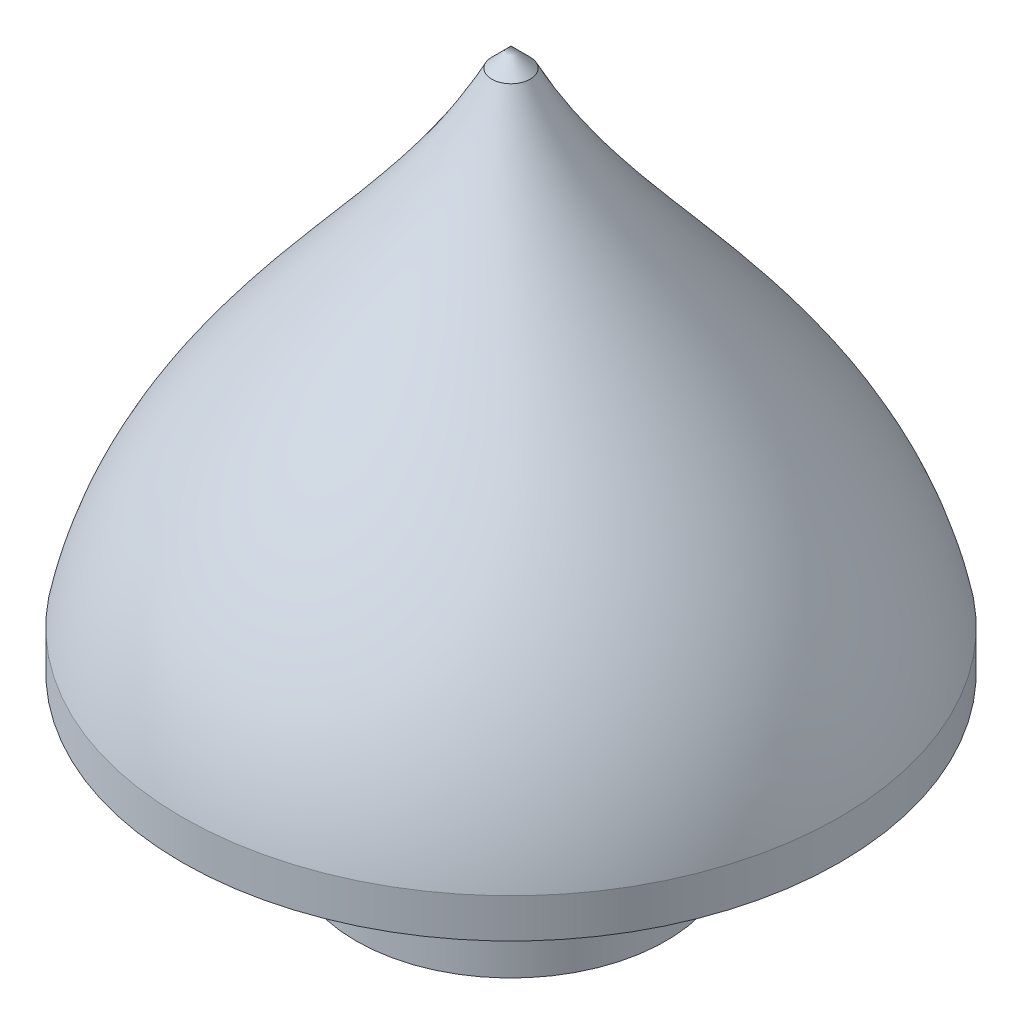
ISO-10303-21;
HEADER;
FILE_DESCRIPTION(('STEP AP214'),'2;1');
FILE_NAME('part.step','',(''),(''),'','','');
FILE_SCHEMA(('AUTOMOTIVE_DESIGN { 1 0 10303 214 1 1 1 1 }'));
ENDSEC;
DATA;
#1=APPLICATION_CONTEXT('core data for automotive mechanical design processes');
#2=APPLICATION_PROTOCOL_DEFINITION('international standard','automotive_design',2000,#1);
#3=PRODUCT_CONTEXT('',#1,'mechanical');
#4=PRODUCT('Part','Part','',(#3));
#5=PRODUCT_RELATED_PRODUCT_CATEGORY('part','',(#4));
#6=PRODUCT_DEFINITION_FORMATION('','',#4);
#7=PRODUCT_DEFINITION_CONTEXT('part definition',#1,'design');
#8=PRODUCT_DEFINITION('design','',#6,#7);
#9=PRODUCT_DEFINITION_SHAPE('','',#8);
#10=(LENGTH_UNIT() NAMED_UNIT(*) SI_UNIT(.MILLI.,.METRE.));
#11=(NAMED_UNIT(*) PLANE_ANGLE_UNIT() SI_UNIT($,.RADIAN.));
#12=(NAMED_UNIT(*) SI_UNIT($,.STERADIAN.) SOLID_ANGLE_UNIT());
#13=UNCERTAINTY_MEASURE_WITH_UNIT(LENGTH_MEASURE(1.E-05),#10,'distance_accuracy_value','');
#14=(GEOMETRIC_REPRESENTATION_CONTEXT(3) GLOBAL_UNCERTAINTY_ASSIGNED_CONTEXT((#13)) GLOBAL_UNIT_ASSIGNED_CONTEXT((#10,
#11,#12)) REPRESENTATION_CONTEXT('',''));
#15=CARTESIAN_POINT('',(0.,0.,0.));
#16=DIRECTION('',(0.,0.,1.));
#17=DIRECTION('',(1.,0.,0.));
#18=AXIS2_PLACEMENT_3D('',#15,#16,#17);
#19=CARTESIAN_POINT('',(0.,7.,0.));
#20=DIRECTION('',(0.,-1.,0.));
#21=DIRECTION('',(0.,0.,-1.));
#22=AXIS2_PLACEMENT_3D('',#19,#20,#21);
#23=CONICAL_SURFACE('',#22,0.,0.785398163397438);
#24=CARTESIAN_POINT('',(0.,6.75257649370923,0.));
#25=DIRECTION('',(0.,-1.,0.));
#26=DIRECTION('',(0.,0.,-1.));
#27=AXIS2_PLACEMENT_3D('',#24,#25,#26);
#28=CIRCLE('',#27,0.247423506290761);
#29=CARTESIAN_POINT('',(0.,6.75257649370923,-0.247423506290761));
#30=VERTEX_POINT('',#29);
#31=EDGE_CURVE('E11',#30,#30,#28,.T.);
#32=ORIENTED_EDGE('',*,*,#31,.F.);
#33=EDGE_LOOP('',(#32));
#34=FACE_BOUND('',#33,.T.);
#35=CARTESIAN_POINT('',(0.,7.,0.));
#36=VERTEX_POINT('',#35);
#37=VERTEX_LOOP('',#36);
#38=FACE_BOUND('',#37,.T.);
#39=ADVANCED_FACE('F33',(#34,#38),#23,.T.);
#40=CARTESIAN_POINT('',(-0.247423506290761,6.75257649370924,0.));
#41=CARTESIAN_POINT('',(-1.37731233628629,4.51509097975712,0.));
#42=CARTESIAN_POINT('',(-3.6972749551022,3.08189891885917,0.));
#43=CARTESIAN_POINT('',(-4.24433157335061,0.506327417075365,0.));
#44=B_SPLINE_CURVE_WITH_KNOTS('',3,(#40,#41,#42,#43),.UNSPECIFIED.,.F.,.F.,(4,4),(0.,1.),.UNSPECIFIED.);
#45=CARTESIAN_POINT('',(0.,-2.,0.));
#46=DIRECTION('',(0.,-1.,0.));
#47=AXIS1_PLACEMENT('',#45,#46);
#48=SURFACE_OF_REVOLUTION('',#44,#47);
#49=CARTESIAN_POINT('',(0.,0.506327417075365,0.));
#50=DIRECTION('',(0.,-1.,0.));
#51=DIRECTION('',(0.,0.,-1.));
#52=AXIS2_PLACEMENT_3D('',#49,#50,#51);
#53=CIRCLE('',#52,4.24433157335061);
#54=CARTESIAN_POINT('',(0.,0.506327417075365,-4.24433157335061));
#55=VERTEX_POINT('',#54);
#56=EDGE_CURVE('E39',#55,#55,#53,.T.);
#57=ORIENTED_EDGE('',*,*,#56,.F.);
#58=EDGE_LOOP('',(#57));
#59=FACE_BOUND('',#58,.T.);
#60=ORIENTED_EDGE('',*,*,#31,.T.);
#61=EDGE_LOOP('',(#60));
#62=FACE_BOUND('',#61,.T.);
#63=ADVANCED_FACE('F43',(#59,#62),#48,.T.);
#64=CARTESIAN_POINT('',(0.,-2.,0.));
#65=DIRECTION('',(0.,-1.,0.));
#66=DIRECTION('',(0.,0.,-1.));
#67=AXIS2_PLACEMENT_3D('',#64,#65,#66);
#68=CYLINDRICAL_SURFACE('',#67,4.24433157335061);
#69=CARTESIAN_POINT('',(0.,0.,0.));
#70=DIRECTION('',(0.,-1.,0.));
#71=DIRECTION('',(0.,0.,-1.));
#72=AXIS2_PLACEMENT_3D('',#69,#70,#71);
#73=CIRCLE('',#72,4.24433157335061);
#74=CARTESIAN_POINT('',(0.,0.,-4.24433157335061));
#75=VERTEX_POINT('',#74);
#76=EDGE_CURVE('E74',#75,#75,#73,.T.);
#77=ORIENTED_EDGE('',*,*,#76,.F.);
#78=EDGE_LOOP('',(#77));
#79=FACE_BOUND('',#78,.T.);
#80=ORIENTED_EDGE('',*,*,#56,.T.);
#81=EDGE_LOOP('',(#80));
#82=FACE_BOUND('',#81,.T.);
#83=ADVANCED_FACE('F48',(#79,#82),#68,.T.);
#84=CARTESIAN_POINT('',(-2.,0.,0.));
#85=DIRECTION('',(0.,1.,0.));
#86=DIRECTION('',(0.,0.,1.));
#87=AXIS2_PLACEMENT_3D('',#84,#85,#86);
#88=PLANE('',#87);
#89=CARTESIAN_POINT('',(0.,0.,0.));
#90=DIRECTION('',(0.,-1.,0.));
#91=DIRECTION('',(0.,0.,-1.));
#92=AXIS2_PLACEMENT_3D('',#89,#90,#91);
#93=CIRCLE('',#92,2.);
#94=CARTESIAN_POINT('',(0.,0.,-2.));
#95=VERTEX_POINT('',#94);
#96=EDGE_CURVE('E71',#95,#95,#93,.T.);
#97=ORIENTED_EDGE('',*,*,#96,.F.);
#98=EDGE_LOOP('',(#97));
#99=FACE_BOUND('',#98,.T.);
#100=ORIENTED_EDGE('',*,*,#76,.T.);
#101=EDGE_LOOP('',(#100));
#102=FACE_BOUND('',#101,.T.);
#103=ADVANCED_FACE('F55',(#99,#102),#88,.F.);
#104=CARTESIAN_POINT('',(0.,-2.,0.));
#105=DIRECTION('',(0.,-1.,0.));
#106=DIRECTION('',(0.,0.,-1.));
#107=AXIS2_PLACEMENT_3D('',#104,#105,#106);
#108=CYLINDRICAL_SURFACE('',#107,2.);
#109=CARTESIAN_POINT('',(0.,-2.,0.));
#110=DIRECTION('',(0.,-1.,0.));
#111=DIRECTION('',(0.,0.,-1.));
#112=AXIS2_PLACEMENT_3D('',#109,#110,#111);
#113=CIRCLE('',#112,2.);
#114=CARTESIAN_POINT('',(0.,-2.,-2.));
#115=VERTEX_POINT('',#114);
#116=EDGE_CURVE('E65',#115,#115,#113,.T.);
#117=ORIENTED_EDGE('',*,*,#116,.F.);
#118=EDGE_LOOP('',(#117));
#119=FACE_BOUND('',#118,.T.);
#120=ORIENTED_EDGE('',*,*,#96,.T.);
#121=EDGE_LOOP('',(#120));
#122=FACE_BOUND('',#121,.T.);
#123=ADVANCED_FACE('F81',(#119,#122),#108,.T.);
#124=CARTESIAN_POINT('',(0.,-2.,0.));
#125=DIRECTION('',(0.,1.,0.));
#126=DIRECTION('',(0.,0.,1.));
#127=AXIS2_PLACEMENT_3D('',#124,#125,#126);
#128=PLANE('',#127);
#129=ORIENTED_EDGE('',*,*,#116,.T.);
#130=EDGE_LOOP('',(#129));
#131=FACE_BOUND('',#130,.T.);
#132=ADVANCED_FACE('F86',(#131),#128,.F.);
#133=CLOSED_SHELL('',(#39,#63,#83,#103,#123,#132));
#134=MANIFOLD_SOLID_BREP('B2',#133);
#135=ADVANCED_BREP_SHAPE_REPRESENTATION('',(#18,#134),#14);
#136=SHAPE_DEFINITION_REPRESENTATION(#9,#135);
ENDSEC;
END-ISO-10303-21;
